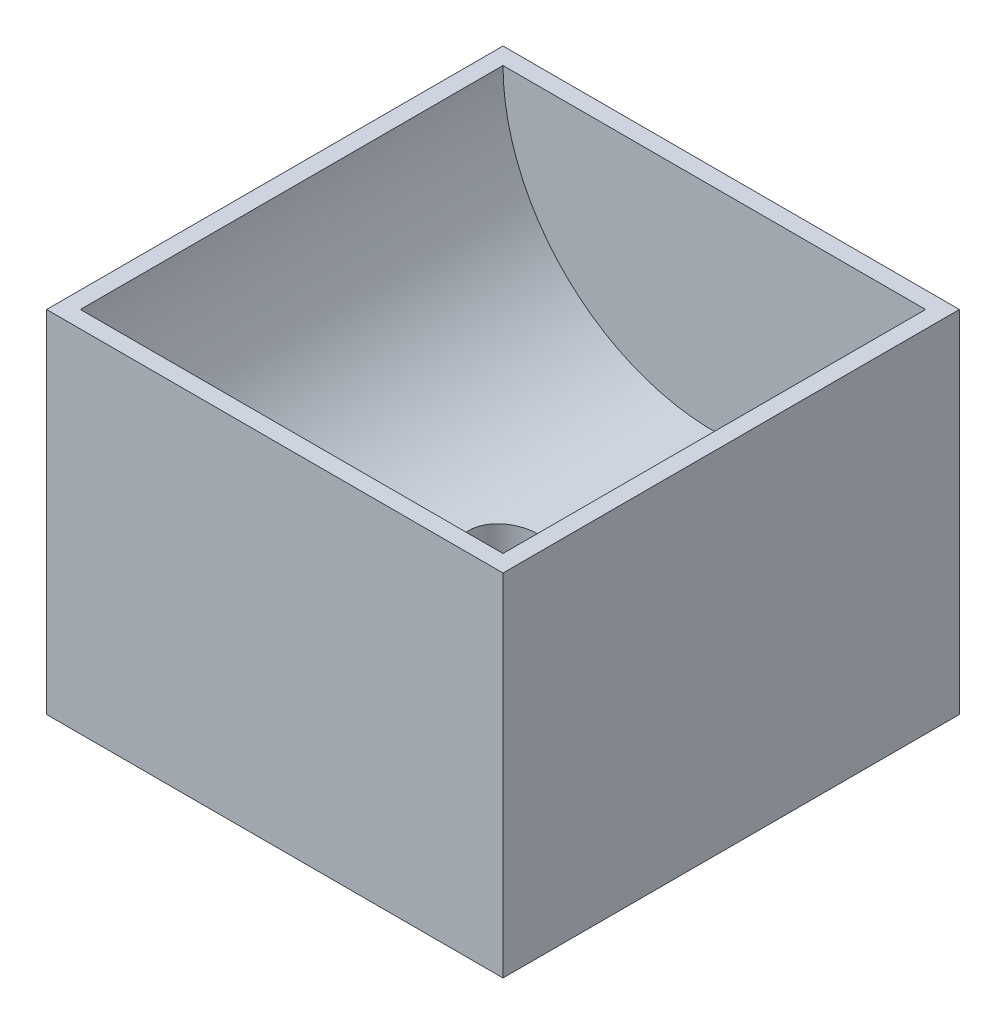
ISO-10303-21;
HEADER;
FILE_DESCRIPTION(('STEP AP214'),'2;1');
FILE_NAME('part.step','',(''),(''),'','','');
FILE_SCHEMA(('AUTOMOTIVE_DESIGN { 1 0 10303 214 1 1 1 1 }'));
ENDSEC;
DATA;
#1=APPLICATION_CONTEXT('core data for automotive mechanical design processes');
#2=APPLICATION_PROTOCOL_DEFINITION('international standard','automotive_design',2000,#1);
#3=PRODUCT_CONTEXT('',#1,'mechanical');
#4=PRODUCT('Part','Part','',(#3));
#5=PRODUCT_RELATED_PRODUCT_CATEGORY('part','',(#4));
#6=PRODUCT_DEFINITION_FORMATION('','',#4);
#7=PRODUCT_DEFINITION_CONTEXT('part definition',#1,'design');
#8=PRODUCT_DEFINITION('design','',#6,#7);
#9=PRODUCT_DEFINITION_SHAPE('','',#8);
#10=(LENGTH_UNIT() NAMED_UNIT(*) SI_UNIT(.MILLI.,.METRE.));
#11=(NAMED_UNIT(*) PLANE_ANGLE_UNIT() SI_UNIT($,.RADIAN.));
#12=(NAMED_UNIT(*) SI_UNIT($,.STERADIAN.) SOLID_ANGLE_UNIT());
#13=UNCERTAINTY_MEASURE_WITH_UNIT(LENGTH_MEASURE(1.E-05),#10,'distance_accuracy_value','');
#14=(GEOMETRIC_REPRESENTATION_CONTEXT(3) GLOBAL_UNCERTAINTY_ASSIGNED_CONTEXT((#13)) GLOBAL_UNIT_ASSIGNED_CONTEXT((#10,
#11,#12)) REPRESENTATION_CONTEXT('',''));
#15=CARTESIAN_POINT('',(0.,0.,0.));
#16=DIRECTION('',(0.,0.,1.));
#17=DIRECTION('',(1.,0.,0.));
#18=AXIS2_PLACEMENT_3D('',#15,#16,#17);
#19=CARTESIAN_POINT('',(-3.75277674973257,-41.5,6.5));
#20=DIRECTION('',(0.866025403784439,0.,-0.5));
#21=DIRECTION('',(-0.5,0.,-0.866025403784439));
#22=AXIS2_PLACEMENT_3D('',#19,#20,#21);
#23=PLANE('',#22);
#24=DIRECTION('',(0.,1.,0.));
#25=VECTOR('',#24,1.);
#26=CARTESIAN_POINT('',(-3.75277674973257,-41.5,6.5));
#27=LINE('',#26,#25);
#28=CARTESIAN_POINT('',(-3.75277674973257,-34.5,6.5));
#29=VERTEX_POINT('',#28);
#30=CARTESIAN_POINT('',(-3.75277674973257,-28.,6.5));
#31=VERTEX_POINT('',#30);
#32=EDGE_CURVE('E145',#29,#31,#27,.T.);
#33=ORIENTED_EDGE('',*,*,#32,.F.);
#34=DIRECTION('',(-0.5,0.,-0.866025403784439));
#35=VECTOR('',#34,1.);
#36=CARTESIAN_POINT('',(-3.75277674973257,-34.5,6.5));
#37=LINE('',#36,#35);
#38=CARTESIAN_POINT('',(-7.50555349946513,-34.5,0.));
#39=VERTEX_POINT('',#38);
#40=EDGE_CURVE('E55',#29,#39,#37,.T.);
#41=ORIENTED_EDGE('',*,*,#40,.T.);
#42=DIRECTION('',(0.,1.,0.));
#43=VECTOR('',#42,1.);
#44=CARTESIAN_POINT('',(-7.50555349946513,-41.5,0.));
#45=LINE('',#44,#43);
#46=CARTESIAN_POINT('',(-7.50555349946513,-28.,0.));
#47=VERTEX_POINT('',#46);
#48=EDGE_CURVE('E159',#39,#47,#45,.T.);
#49=ORIENTED_EDGE('',*,*,#48,.T.);
#50=DIRECTION('',(-0.5,0.,-0.866025403784438));
#51=VECTOR('',#50,1.);
#52=CARTESIAN_POINT('',(-3.75277674973257,-28.,6.5));
#53=LINE('',#52,#51);
#54=EDGE_CURVE('E487',#31,#47,#53,.T.);
#55=ORIENTED_EDGE('',*,*,#54,.F.);
#56=EDGE_LOOP('',(#33,#41,#49,#55));
#57=FACE_BOUND('',#56,.T.);
#58=ADVANCED_FACE('F39',(#57),#23,.T.);
#59=CARTESIAN_POINT('',(-7.50555349946513,-41.5,0.));
#60=DIRECTION('',(0.866025403784439,0.,0.5));
#61=DIRECTION('',(0.5,0.,-0.866025403784439));
#62=AXIS2_PLACEMENT_3D('',#59,#60,#61);
#63=PLANE('',#62);
#64=ORIENTED_EDGE('',*,*,#48,.F.);
#65=DIRECTION('',(0.5,0.,-0.866025403784439));
#66=VECTOR('',#65,1.);
#67=CARTESIAN_POINT('',(-7.50555349946513,-34.5,0.));
#68=LINE('',#67,#66);
#69=CARTESIAN_POINT('',(-3.75277674973257,-34.5,-6.5));
#70=VERTEX_POINT('',#69);
#71=EDGE_CURVE('E492',#39,#70,#68,.T.);
#72=ORIENTED_EDGE('',*,*,#71,.T.);
#73=DIRECTION('',(0.,1.,0.));
#74=VECTOR('',#73,1.);
#75=CARTESIAN_POINT('',(-3.75277674973257,-41.5,-6.5));
#76=LINE('',#75,#74);
#77=CARTESIAN_POINT('',(-3.75277674973257,-28.,-6.5));
#78=VERTEX_POINT('',#77);
#79=EDGE_CURVE('E156',#70,#78,#76,.T.);
#80=ORIENTED_EDGE('',*,*,#79,.T.);
#81=DIRECTION('',(0.5,0.,-0.866025403784439));
#82=VECTOR('',#81,1.);
#83=CARTESIAN_POINT('',(-7.50555349946513,-28.,0.));
#84=LINE('',#83,#82);
#85=EDGE_CURVE('E483',#47,#78,#84,.T.);
#86=ORIENTED_EDGE('',*,*,#85,.F.);
#87=EDGE_LOOP('',(#64,#72,#80,#86));
#88=FACE_BOUND('',#87,.T.);
#89=ADVANCED_FACE('F278',(#88),#63,.T.);
#90=CARTESIAN_POINT('',(-3.75277674973257,-41.5,-6.5));
#91=DIRECTION('',(0.,0.,1.));
#92=DIRECTION('',(1.,0.,0.));
#93=AXIS2_PLACEMENT_3D('',#90,#91,#92);
#94=PLANE('',#93);
#95=ORIENTED_EDGE('',*,*,#79,.F.);
#96=DIRECTION('',(1.,0.,0.));
#97=VECTOR('',#96,1.);
#98=CARTESIAN_POINT('',(-3.75277674973257,-34.5,-6.5));
#99=LINE('',#98,#97);
#100=CARTESIAN_POINT('',(3.75277674973257,-34.5,-6.5));
#101=VERTEX_POINT('',#100);
#102=EDGE_CURVE('E496',#70,#101,#99,.T.);
#103=ORIENTED_EDGE('',*,*,#102,.T.);
#104=DIRECTION('',(0.,1.,0.));
#105=VECTOR('',#104,1.);
#106=CARTESIAN_POINT('',(3.75277674973257,-41.5,-6.5));
#107=LINE('',#106,#105);
#108=CARTESIAN_POINT('',(3.75277674973257,-28.,-6.5));
#109=VERTEX_POINT('',#108);
#110=EDGE_CURVE('E149',#101,#109,#107,.T.);
#111=ORIENTED_EDGE('',*,*,#110,.T.);
#112=DIRECTION('',(1.,0.,0.));
#113=VECTOR('',#112,1.);
#114=CARTESIAN_POINT('',(-3.75277674973257,-28.,-6.5));
#115=LINE('',#114,#113);
#116=EDGE_CURVE('E478',#78,#109,#115,.T.);
#117=ORIENTED_EDGE('',*,*,#116,.F.);
#118=EDGE_LOOP('',(#95,#103,#111,#117));
#119=FACE_BOUND('',#118,.T.);
#120=ADVANCED_FACE('F283',(#119),#94,.T.);
#121=CARTESIAN_POINT('',(3.75277674973257,-41.5,-6.5));
#122=DIRECTION('',(-0.866025403784439,0.,0.5));
#123=DIRECTION('',(0.5,0.,0.866025403784439));
#124=AXIS2_PLACEMENT_3D('',#121,#122,#123);
#125=PLANE('',#124);
#126=ORIENTED_EDGE('',*,*,#110,.F.);
#127=DIRECTION('',(0.5,0.,0.866025403784439));
#128=VECTOR('',#127,1.);
#129=CARTESIAN_POINT('',(3.75277674973257,-34.5,-6.5));
#130=LINE('',#129,#128);
#131=CARTESIAN_POINT('',(7.50555349946513,-34.5,0.));
#132=VERTEX_POINT('',#131);
#133=EDGE_CURVE('E137',#101,#132,#130,.T.);
#134=ORIENTED_EDGE('',*,*,#133,.T.);
#135=DIRECTION('',(0.,1.,0.));
#136=VECTOR('',#135,1.);
#137=CARTESIAN_POINT('',(7.50555349946513,-41.5,0.));
#138=LINE('',#137,#136);
#139=CARTESIAN_POINT('',(7.50555349946513,-28.,0.));
#140=VERTEX_POINT('',#139);
#141=EDGE_CURVE('E135',#132,#140,#138,.T.);
#142=ORIENTED_EDGE('',*,*,#141,.T.);
#143=DIRECTION('',(0.5,0.,0.866025403784439));
#144=VECTOR('',#143,1.);
#145=CARTESIAN_POINT('',(3.75277674973257,-28.,-6.5));
#146=LINE('',#145,#144);
#147=EDGE_CURVE('E473',#109,#140,#146,.T.);
#148=ORIENTED_EDGE('',*,*,#147,.F.);
#149=EDGE_LOOP('',(#126,#134,#142,#148));
#150=FACE_BOUND('',#149,.T.);
#151=ADVANCED_FACE('F289',(#150),#125,.T.);
#152=CARTESIAN_POINT('',(7.50555349946513,-41.5,0.));
#153=DIRECTION('',(-0.866025403784439,0.,-0.5));
#154=DIRECTION('',(-0.5,0.,0.866025403784439));
#155=AXIS2_PLACEMENT_3D('',#152,#153,#154);
#156=PLANE('',#155);
#157=ORIENTED_EDGE('',*,*,#141,.F.);
#158=DIRECTION('',(-0.5,0.,0.866025403784439));
#159=VECTOR('',#158,1.);
#160=CARTESIAN_POINT('',(7.50555349946513,-34.5,0.));
#161=LINE('',#160,#159);
#162=CARTESIAN_POINT('',(3.75277674973257,-34.5,6.5));
#163=VERTEX_POINT('',#162);
#164=EDGE_CURVE('E129',#132,#163,#161,.T.);
#165=ORIENTED_EDGE('',*,*,#164,.T.);
#166=DIRECTION('',(0.,1.,0.));
#167=VECTOR('',#166,1.);
#168=CARTESIAN_POINT('',(3.75277674973257,-41.5,6.5));
#169=LINE('',#168,#167);
#170=CARTESIAN_POINT('',(3.75277674973257,-28.,6.5));
#171=VERTEX_POINT('',#170);
#172=EDGE_CURVE('E62',#163,#171,#169,.T.);
#173=ORIENTED_EDGE('',*,*,#172,.T.);
#174=DIRECTION('',(-0.5,0.,0.866025403784439));
#175=VECTOR('',#174,1.);
#176=CARTESIAN_POINT('',(7.50555349946513,-28.,0.));
#177=LINE('',#176,#175);
#178=EDGE_CURVE('E463',#140,#171,#177,.T.);
#179=ORIENTED_EDGE('',*,*,#178,.F.);
#180=EDGE_LOOP('',(#157,#165,#173,#179));
#181=FACE_BOUND('',#180,.T.);
#182=ADVANCED_FACE('F134',(#181),#156,.T.);
#183=CARTESIAN_POINT('',(3.75277674973257,-41.5,6.5));
#184=DIRECTION('',(0.,0.,-1.));
#185=DIRECTION('',(-1.,0.,0.));
#186=AXIS2_PLACEMENT_3D('',#183,#184,#185);
#187=PLANE('',#186);
#188=ORIENTED_EDGE('',*,*,#172,.F.);
#189=DIRECTION('',(-1.,0.,0.));
#190=VECTOR('',#189,1.);
#191=CARTESIAN_POINT('',(3.75277674973257,-34.5,6.5));
#192=LINE('',#191,#190);
#193=EDGE_CURVE('E11',#163,#29,#192,.T.);
#194=ORIENTED_EDGE('',*,*,#193,.T.);
#195=ORIENTED_EDGE('',*,*,#32,.T.);
#196=DIRECTION('',(-1.,0.,0.));
#197=VECTOR('',#196,1.);
#198=CARTESIAN_POINT('',(3.75277674973257,-28.,6.5));
#199=LINE('',#198,#197);
#200=EDGE_CURVE('E142',#171,#31,#199,.T.);
#201=ORIENTED_EDGE('',*,*,#200,.F.);
#202=EDGE_LOOP('',(#188,#194,#195,#201));
#203=FACE_BOUND('',#202,.T.);
#204=ADVANCED_FACE('F140',(#203),#187,.T.);
#205=CARTESIAN_POINT('',(-27.,0.,25.));
#206=DIRECTION('',(1.,0.,0.));
#207=DIRECTION('',(0.,1.,0.));
#208=AXIS2_PLACEMENT_3D('',#205,#206,#207);
#209=PLANE('',#208);
#210=DIRECTION('',(0.,0.,-1.));
#211=VECTOR('',#210,1.);
#212=CARTESIAN_POINT('',(-27.,0.,25.));
#213=LINE('',#212,#211);
#214=CARTESIAN_POINT('',(-27.,0.,27.));
#215=VERTEX_POINT('',#214);
#216=CARTESIAN_POINT('',(-27.,0.,-27.));
#217=VERTEX_POINT('',#216);
#218=EDGE_CURVE('E218',#215,#217,#213,.T.);
#219=ORIENTED_EDGE('',*,*,#218,.T.);
#220=DIRECTION('',(0.,1.,0.));
#221=VECTOR('',#220,1.);
#222=CARTESIAN_POINT('',(-27.,0.,-27.));
#223=LINE('',#222,#221);
#224=CARTESIAN_POINT('',(-27.,-41.5,-27.));
#225=VERTEX_POINT('',#224);
#226=EDGE_CURVE('E186',#225,#217,#223,.T.);
#227=ORIENTED_EDGE('',*,*,#226,.F.);
#228=DIRECTION('',(0.,0.,-1.));
#229=VECTOR('',#228,1.);
#230=CARTESIAN_POINT('',(-27.,-41.5,-27.));
#231=LINE('',#230,#229);
#232=CARTESIAN_POINT('',(-27.,-41.5,27.));
#233=VERTEX_POINT('',#232);
#234=EDGE_CURVE('E162',#233,#225,#231,.T.);
#235=ORIENTED_EDGE('',*,*,#234,.F.);
#236=DIRECTION('',(0.,-1.,0.));
#237=VECTOR('',#236,1.);
#238=CARTESIAN_POINT('',(-27.,0.,27.));
#239=LINE('',#238,#237);
#240=EDGE_CURVE('E199',#215,#233,#239,.T.);
#241=ORIENTED_EDGE('',*,*,#240,.F.);
#242=EDGE_LOOP('',(#219,#227,#235,#241));
#243=FACE_BOUND('',#242,.T.);
#244=ADVANCED_FACE('F41',(#243),#209,.F.);
#245=CARTESIAN_POINT('',(-27.,-28.,25.));
#246=DIRECTION('',(0.,1.,0.));
#247=DIRECTION('',(0.,0.,1.));
#248=AXIS2_PLACEMENT_3D('',#245,#246,#247);
#249=PLANE('',#248);
#250=ORIENTED_EDGE('',*,*,#178,.T.);
#251=ORIENTED_EDGE('',*,*,#200,.T.);
#252=ORIENTED_EDGE('',*,*,#54,.T.);
#253=ORIENTED_EDGE('',*,*,#85,.T.);
#254=ORIENTED_EDGE('',*,*,#116,.T.);
#255=ORIENTED_EDGE('',*,*,#147,.T.);
#256=EDGE_LOOP('',(#250,#251,#252,#253,#254,#255));
#257=FACE_BOUND('',#256,.T.);
#258=CARTESIAN_POINT('',(0.,-28.,0.));
#259=DIRECTION('',(0.,-1.,0.));
#260=DIRECTION('',(0.,0.,-1.));
#261=AXIS2_PLACEMENT_3D('',#258,#259,#260);
#262=CIRCLE('',#261,4.05);
#263=CARTESIAN_POINT('',(0.,-28.,-4.05));
#264=VERTEX_POINT('',#263);
#265=EDGE_CURVE('E178',#264,#264,#262,.T.);
#266=ORIENTED_EDGE('',*,*,#265,.F.);
#267=EDGE_LOOP('',(#266));
#268=FACE_BOUND('',#267,.T.);
#269=ADVANCED_FACE('F372',(#257,#268),#249,.F.);
#270=CARTESIAN_POINT('',(27.,0.,25.));
#271=DIRECTION('',(-1.,0.,0.));
#272=DIRECTION('',(0.,-1.,0.));
#273=AXIS2_PLACEMENT_3D('',#270,#271,#272);
#274=PLANE('',#273);
#275=DIRECTION('',(0.,1.,0.));
#276=VECTOR('',#275,1.);
#277=CARTESIAN_POINT('',(27.,0.,27.));
#278=LINE('',#277,#276);
#279=CARTESIAN_POINT('',(27.,-41.5,27.));
#280=VERTEX_POINT('',#279);
#281=CARTESIAN_POINT('',(27.,0.,27.));
#282=VERTEX_POINT('',#281);
#283=EDGE_CURVE('E202',#280,#282,#278,.T.);
#284=ORIENTED_EDGE('',*,*,#283,.F.);
#285=DIRECTION('',(0.,0.,1.));
#286=VECTOR('',#285,1.);
#287=CARTESIAN_POINT('',(27.,-41.5,-27.));
#288=LINE('',#287,#286);
#289=CARTESIAN_POINT('',(27.,-41.5,-27.));
#290=VERTEX_POINT('',#289);
#291=EDGE_CURVE('E170',#290,#280,#288,.T.);
#292=ORIENTED_EDGE('',*,*,#291,.F.);
#293=DIRECTION('',(0.,-1.,0.));
#294=VECTOR('',#293,1.);
#295=CARTESIAN_POINT('',(27.,0.,-27.));
#296=LINE('',#295,#294);
#297=CARTESIAN_POINT('',(27.,0.,-27.));
#298=VERTEX_POINT('',#297);
#299=EDGE_CURVE('E183',#298,#290,#296,.T.);
#300=ORIENTED_EDGE('',*,*,#299,.F.);
#301=DIRECTION('',(0.,0.,-1.));
#302=VECTOR('',#301,1.);
#303=CARTESIAN_POINT('',(27.,0.,25.));
#304=LINE('',#303,#302);
#305=EDGE_CURVE('E48',#282,#298,#304,.T.);
#306=ORIENTED_EDGE('',*,*,#305,.F.);
#307=EDGE_LOOP('',(#284,#292,#300,#306));
#308=FACE_BOUND('',#307,.T.);
#309=ADVANCED_FACE('F273',(#308),#274,.F.);
#310=CARTESIAN_POINT('',(0.,0.,25.));
#311=DIRECTION('',(0.,0.,-1.));
#312=DIRECTION('',(-1.,0.,0.));
#313=AXIS2_PLACEMENT_3D('',#310,#311,#312);
#314=CYLINDRICAL_SURFACE('',#313,25.);
#315=CARTESIAN_POINT('',(0.,-25.,-4.05));
#316=CARTESIAN_POINT('',(0.225904941622165,-24.9999961934764,-4.04999086328005));
#317=CARTESIAN_POINT('',(0.451935439243622,-24.9969060661573,-4.03103503458935));
#318=CARTESIAN_POINT('',(0.897663239289137,-24.9848764515723,-3.95574050644908));
#319=CARTESIAN_POINT('',(1.11735441766579,-24.9759314936109,-3.89936684345346));
#320=CARTESIAN_POINT('',(1.54388979151633,-24.9531960700265,-3.75097820197135));
#321=CARTESIAN_POINT('',(1.75074411190022,-24.9394094818384,-3.6589917380909));
#322=CARTESIAN_POINT('',(2.14605421563331,-24.9085088576696,-3.44206190148828));
#323=CARTESIAN_POINT('',(2.33451222960713,-24.8913952258606,-3.3171225312538));
#324=CARTESIAN_POINT('',(2.68941425201728,-24.855566144543,-3.03662958739046));
#325=CARTESIAN_POINT('',(2.85566754139279,-24.8368388409761,-2.88083618935496));
#326=CARTESIAN_POINT('',(3.15979390851473,-24.7999844215049,-2.54357378272033));
#327=CARTESIAN_POINT('',(3.29766524230569,-24.7818573425394,-2.36210319751806));
#328=CARTESIAN_POINT('',(3.54187208650707,-24.7481409442433,-1.97733579698426));
#329=CARTESIAN_POINT('',(3.6480201700076,-24.7325669438563,-1.77391856493269));
#330=CARTESIAN_POINT('',(3.82456902883672,-24.7058837876552,-1.35184704790755));
#331=CARTESIAN_POINT('',(3.89497208230338,-24.6947743473108,-1.13319373498551));
#332=CARTESIAN_POINT('',(3.99743395180631,-24.6783957627468,-0.688874039514271));
#333=CARTESIAN_POINT('',(4.02982125765026,-24.6730766147854,-0.463285285755881));
#334=CARTESIAN_POINT('',(4.05635051331019,-24.6687294550054,-0.00981733674435749));
#335=CARTESIAN_POINT('',(4.05049502081669,-24.6697010224617,0.218061704315857));
#336=CARTESIAN_POINT('',(4.00097271605705,-24.6777798431963,0.667303767984101));
#337=CARTESIAN_POINT('',(3.95767399543278,-24.6848273638047,0.88870859732611));
#338=CARTESIAN_POINT('',(3.83507156711337,-24.7041705677243,1.32106890227756));
#339=CARTESIAN_POINT('',(3.75576668693695,-24.7164664219381,1.5320240373618));
#340=CARTESIAN_POINT('',(3.56302713098684,-24.7449858091278,1.93860387763864));
#341=CARTESIAN_POINT('',(3.44943871741267,-24.7612269686571,2.13415441609948));
#342=CARTESIAN_POINT('',(3.19146570115959,-24.7957946178875,2.50355929915205));
#343=CARTESIAN_POINT('',(3.04707874729407,-24.8141212667469,2.67741198570437));
#344=CARTESIAN_POINT('',(2.7295973752225,-24.8510578332574,3.00061758480667));
#345=CARTESIAN_POINT('',(2.55618694702339,-24.8696685570055,3.14966016658154));
#346=CARTESIAN_POINT('',(2.18665227170224,-24.9048779116795,3.41657742775882));
#347=CARTESIAN_POINT('',(1.9905278928337,-24.9214765309337,3.53445192636566));
#348=CARTESIAN_POINT('',(1.58084739942649,-24.9508131545028,3.7357116580168));
#349=CARTESIAN_POINT('',(1.36727808760575,-24.9635482010002,3.81907048477718));
#350=CARTESIAN_POINT('',(0.928918698808064,-24.9836987735145,3.94864992211037));
#351=CARTESIAN_POINT('',(0.70412950956313,-24.9911147196745,3.99487346594571));
#352=CARTESIAN_POINT('',(0.25238711137549,-24.9997352674817,4.04845186325925));
#353=CARTESIAN_POINT('',(0.0254857048201214,-25.0010079735628,4.05623291603066));
#354=CARTESIAN_POINT('',(-0.426379540073973,-24.9973848419376,4.03384026862514));
#355=CARTESIAN_POINT('',(-0.651343448414816,-24.9924892280431,4.00366794555094));
#356=CARTESIAN_POINT('',(-1.09163874189494,-24.9771216796237,3.90657950086741));
#357=CARTESIAN_POINT('',(-1.3070176487652,-24.9666816297807,3.8398734080296));
#358=CARTESIAN_POINT('',(-1.72353500463252,-24.9413913707769,3.67183416187441));
#359=CARTESIAN_POINT('',(-1.92467269030422,-24.9265409254415,3.57049915415072));
#360=CARTESIAN_POINT('',(-2.30885594868339,-24.8939090791851,3.33509559325188));
#361=CARTESIAN_POINT('',(-2.49173562116102,-24.8761041392849,3.20075961269004));
#362=CARTESIAN_POINT('',(-2.83250780907755,-24.8396120068525,2.90353657085682));
#363=CARTESIAN_POINT('',(-2.99039861432037,-24.8209247540499,2.74064755707027));
#364=CARTESIAN_POINT('',(-3.27828256151623,-24.7845551791635,2.38903479857993));
#365=CARTESIAN_POINT('',(-3.40798838714218,-24.766884445078,2.20007442709659));
#366=CARTESIAN_POINT('',(-3.63381665804737,-24.7347618079045,1.80279725531662));
#367=CARTESIAN_POINT('',(-3.72994012433369,-24.7203098069619,1.59448104374091));
#368=CARTESIAN_POINT('',(-3.88544082513768,-24.6963470280393,1.16522435003992));
#369=CARTESIAN_POINT('',(-3.94496344162132,-24.6868167251159,0.944337672243569));
#370=CARTESIAN_POINT('',(-4.02603189591409,-24.6737265605381,0.495535006331872));
#371=CARTESIAN_POINT('',(-4.04758083598822,-24.6701662111687,0.267619593978031));
#372=CARTESIAN_POINT('',(-4.05200739704203,-24.6694392859081,-0.185903406261004));
#373=CARTESIAN_POINT('',(-4.03533711301245,-24.6721979619537,-0.411506589960847));
#374=CARTESIAN_POINT('',(-3.96477346920322,-24.6836348318998,-0.8566537596565));
#375=CARTESIAN_POINT('',(-3.91088021130487,-24.6923130095984,-1.0761977622349));
#376=CARTESIAN_POINT('',(-3.76756983310923,-24.7145833208507,-1.50283402460804));
#377=CARTESIAN_POINT('',(-3.67818952210202,-24.7281703613285,-1.70993893151023));
#378=CARTESIAN_POINT('',(-3.46648818843274,-24.7587327593538,-2.10628700693225));
#379=CARTESIAN_POINT('',(-3.34416568071904,-24.7757082696464,-2.29552936967962));
#380=CARTESIAN_POINT('',(-3.06843025618658,-24.811372855856,-2.65306838018514));
#381=CARTESIAN_POINT('',(-2.9146840625354,-24.8300790135039,-2.8211063345267));
#382=CARTESIAN_POINT('',(-2.5811690987387,-24.866959107524,-3.12915399846034));
#383=CARTESIAN_POINT('',(-2.40139432082136,-24.8851329198556,-3.26915721940531));
#384=CARTESIAN_POINT('',(-2.01954214880413,-24.9190368036741,-3.51798673595506));
#385=CARTESIAN_POINT('',(-1.81732758258995,-24.9347502497644,-3.62660479592379));
#386=CARTESIAN_POINT('',(-1.39735492071511,-24.9618009013644,-3.80816598500582));
#387=CARTESIAN_POINT('',(-1.17961274064209,-24.973142513665,-3.88114505798834));
#388=CARTESIAN_POINT('',(-0.800821196414011,-24.987663381964,-3.9733076516855));
#389=CARTESIAN_POINT('',(-0.64207746139349,-24.9922651690441,-4.00202184047208));
#390=CARTESIAN_POINT('',(-0.322243757958618,-24.9984348119197,-4.04037112343737));
#391=CARTESIAN_POINT('',(-0.16115382650699,-25.00000271546,-4.05000651786265));
#392=CARTESIAN_POINT('',(0.,-25.,-4.05));
#393=B_SPLINE_CURVE_WITH_KNOTS('',3,(#315,#316,#317,#318,#319,#320,#321,#322,#323,#324,#325,
#326,#327,#328,#329,#330,#331,#332,#333,#334,#335,#336,#337,#338,#339,#340,#341,#342,#343,#344,
#345,#346,#347,#348,#349,#350,#351,#352,#353,#354,#355,#356,#357,#358,#359,#360,#361,#362,#363,
#364,#365,#366,#367,#368,#369,#370,#371,#372,#373,#374,#375,#376,#377,#378,#379,#380,#381,#382,
#383,#384,#385,#386,#387,#388,#389,#390,#391,#392),.UNSPECIFIED.,.T.,.F.,(4,2,2,2,2,2,2,2,2,2,2,
2,2,2,2,2,2,2,2,2,2,2,2,2,2,2,2,2,2,2,2,2,2,2,2,2,2,2,4),(0.,0.677125816897778,1.35488523837845,
2.03210310720666,2.70923875843311,3.39186031286574,4.07452379909867,4.76114428476695,
5.44772100455552,6.12832036825223,6.80887421371311,7.482812853352,8.1567734402668,
8.8338023441129,9.5108829514275,10.1958826696799,10.8808863612981,11.5664131523583,
12.2518857893186,12.9297414918444,13.6075725997196,14.281547219687,14.9555579371957,
15.6352220001272,16.3149325580298,17.0012769776374,17.6876005284462,18.3711800247511,
19.0547036733405,19.7301837028493,20.4056618835402,21.0804412407615,21.7552510224862,
22.43762839497,23.1201635218058,23.8071283107365,24.4933988197829,24.9764477205331,
25.4594890193917),.UNSPECIFIED.);
#394=CARTESIAN_POINT('',(0.,-25.,-4.05));
#395=VERTEX_POINT('',#394);
#396=EDGE_CURVE('E182',#395,#395,#393,.T.);
#397=ORIENTED_EDGE('',*,*,#396,.T.);
#398=EDGE_LOOP('',(#397));
#399=FACE_BOUND('',#398,.T.);
#400=CARTESIAN_POINT('',(0.,0.,-25.));
#401=DIRECTION('',(0.,0.,-1.));
#402=DIRECTION('',(1.,0.,0.));
#403=AXIS2_PLACEMENT_3D('',#400,#401,#402);
#404=CIRCLE('',#403,25.);
#405=CARTESIAN_POINT('',(25.,0.,-25.));
#406=VERTEX_POINT('',#405);
#407=CARTESIAN_POINT('',(-25.,0.,-25.));
#408=VERTEX_POINT('',#407);
#409=EDGE_CURVE('E210',#406,#408,#404,.T.);
#410=ORIENTED_EDGE('',*,*,#409,.T.);
#411=DIRECTION('',(0.,0.,-1.));
#412=VECTOR('',#411,1.);
#413=CARTESIAN_POINT('',(-25.,0.,25.));
#414=LINE('',#413,#412);
#415=CARTESIAN_POINT('',(-25.,0.,25.));
#416=VERTEX_POINT('',#415);
#417=EDGE_CURVE('E224',#416,#408,#414,.T.);
#418=ORIENTED_EDGE('',*,*,#417,.F.);
#419=CARTESIAN_POINT('',(0.,0.,25.));
#420=DIRECTION('',(0.,0.,-1.));
#421=DIRECTION('',(1.,0.,0.));
#422=AXIS2_PLACEMENT_3D('',#419,#420,#421);
#423=CIRCLE('',#422,25.);
#424=CARTESIAN_POINT('',(25.,0.,25.));
#425=VERTEX_POINT('',#424);
#426=EDGE_CURVE('E214',#425,#416,#423,.T.);
#427=ORIENTED_EDGE('',*,*,#426,.F.);
#428=DIRECTION('',(0.,0.,-1.));
#429=VECTOR('',#428,1.);
#430=CARTESIAN_POINT('',(25.,0.,25.));
#431=LINE('',#430,#429);
#432=EDGE_CURVE('E228',#425,#406,#431,.T.);
#433=ORIENTED_EDGE('',*,*,#432,.T.);
#434=EDGE_LOOP('',(#410,#418,#427,#433));
#435=FACE_BOUND('',#434,.T.);
#436=ADVANCED_FACE('F240',(#399,#435),#314,.F.);
#437=CARTESIAN_POINT('',(-27.,0.,25.));
#438=DIRECTION('',(0.,-1.,0.));
#439=DIRECTION('',(0.,0.,-1.));
#440=AXIS2_PLACEMENT_3D('',#437,#438,#439);
#441=PLANE('',#440);
#442=DIRECTION('',(1.,0.,0.));
#443=VECTOR('',#442,1.);
#444=CARTESIAN_POINT('',(27.,0.,-27.));
#445=LINE('',#444,#443);
#446=EDGE_CURVE('E191',#217,#298,#445,.T.);
#447=ORIENTED_EDGE('',*,*,#446,.F.);
#448=ORIENTED_EDGE('',*,*,#218,.F.);
#449=DIRECTION('',(-1.,0.,0.));
#450=VECTOR('',#449,1.);
#451=CARTESIAN_POINT('',(-27.,0.,27.));
#452=LINE('',#451,#450);
#453=EDGE_CURVE('E206',#282,#215,#452,.T.);
#454=ORIENTED_EDGE('',*,*,#453,.F.);
#455=ORIENTED_EDGE('',*,*,#305,.T.);
#456=EDGE_LOOP('',(#447,#448,#454,#455));
#457=FACE_BOUND('',#456,.T.);
#458=ORIENTED_EDGE('',*,*,#417,.T.);
#459=DIRECTION('',(1.,0.,0.));
#460=VECTOR('',#459,1.);
#461=CARTESIAN_POINT('',(27.,0.,-25.));
#462=LINE('',#461,#460);
#463=EDGE_CURVE('E187',#408,#406,#462,.T.);
#464=ORIENTED_EDGE('',*,*,#463,.T.);
#465=ORIENTED_EDGE('',*,*,#432,.F.);
#466=DIRECTION('',(-1.,0.,0.));
#467=VECTOR('',#466,1.);
#468=CARTESIAN_POINT('',(-27.,0.,25.));
#469=LINE('',#468,#467);
#470=EDGE_CURVE('E195',#425,#416,#469,.T.);
#471=ORIENTED_EDGE('',*,*,#470,.T.);
#472=EDGE_LOOP('',(#458,#464,#465,#471));
#473=FACE_BOUND('',#472,.T.);
#474=ADVANCED_FACE('F266',(#457,#473),#441,.F.);
#475=CARTESIAN_POINT('',(0.,0.,25.));
#476=DIRECTION('',(0.,0.,1.));
#477=DIRECTION('',(1.,0.,0.));
#478=AXIS2_PLACEMENT_3D('',#475,#476,#477);
#479=PLANE('',#478);
#480=ORIENTED_EDGE('',*,*,#470,.F.);
#481=ORIENTED_EDGE('',*,*,#426,.T.);
#482=EDGE_LOOP('',(#480,#481));
#483=FACE_BOUND('',#482,.T.);
#484=ADVANCED_FACE('F263',(#483),#479,.F.);
#485=CARTESIAN_POINT('',(0.,0.,27.));
#486=DIRECTION('',(0.,0.,1.));
#487=DIRECTION('',(1.,0.,0.));
#488=AXIS2_PLACEMENT_3D('',#485,#486,#487);
#489=PLANE('',#488);
#490=ORIENTED_EDGE('',*,*,#240,.T.);
#491=DIRECTION('',(-1.,0.,0.));
#492=VECTOR('',#491,1.);
#493=CARTESIAN_POINT('',(-27.,-41.5,27.));
#494=LINE('',#493,#492);
#495=EDGE_CURVE('E174',#280,#233,#494,.T.);
#496=ORIENTED_EDGE('',*,*,#495,.F.);
#497=ORIENTED_EDGE('',*,*,#283,.T.);
#498=ORIENTED_EDGE('',*,*,#453,.T.);
#499=EDGE_LOOP('',(#490,#496,#497,#498));
#500=FACE_BOUND('',#499,.T.);
#501=ADVANCED_FACE('F259',(#500),#489,.T.);
#502=CARTESIAN_POINT('',(0.,0.,-25.));
#503=DIRECTION('',(0.,0.,-1.));
#504=DIRECTION('',(-1.,0.,0.));
#505=AXIS2_PLACEMENT_3D('',#502,#503,#504);
#506=PLANE('',#505);
#507=ORIENTED_EDGE('',*,*,#409,.F.);
#508=ORIENTED_EDGE('',*,*,#463,.F.);
#509=EDGE_LOOP('',(#507,#508));
#510=FACE_BOUND('',#509,.T.);
#511=ADVANCED_FACE('F255',(#510),#506,.F.);
#512=CARTESIAN_POINT('',(0.,0.,-27.));
#513=DIRECTION('',(0.,0.,-1.));
#514=DIRECTION('',(-1.,0.,0.));
#515=AXIS2_PLACEMENT_3D('',#512,#513,#514);
#516=PLANE('',#515);
#517=ORIENTED_EDGE('',*,*,#299,.T.);
#518=DIRECTION('',(1.,0.,0.));
#519=VECTOR('',#518,1.);
#520=CARTESIAN_POINT('',(-27.,-41.5,-27.));
#521=LINE('',#520,#519);
#522=EDGE_CURVE('E166',#225,#290,#521,.T.);
#523=ORIENTED_EDGE('',*,*,#522,.F.);
#524=ORIENTED_EDGE('',*,*,#226,.T.);
#525=ORIENTED_EDGE('',*,*,#446,.T.);
#526=EDGE_LOOP('',(#517,#523,#524,#525));
#527=FACE_BOUND('',#526,.T.);
#528=ADVANCED_FACE('F250',(#527),#516,.T.);
#529=CARTESIAN_POINT('',(0.,0.,0.));
#530=DIRECTION('',(0.,-1.,0.));
#531=DIRECTION('',(0.,0.,-1.));
#532=AXIS2_PLACEMENT_3D('',#529,#530,#531);
#533=CYLINDRICAL_SURFACE('',#532,4.05);
#534=ORIENTED_EDGE('',*,*,#265,.T.);
#535=EDGE_LOOP('',(#534));
#536=FACE_BOUND('',#535,.T.);
#537=ORIENTED_EDGE('',*,*,#396,.F.);
#538=EDGE_LOOP('',(#537));
#539=FACE_BOUND('',#538,.T.);
#540=ADVANCED_FACE('F244',(#536,#539),#533,.F.);
#541=CARTESIAN_POINT('',(0.,-41.5,0.));
#542=DIRECTION('',(0.,1.,0.));
#543=DIRECTION('',(0.,0.,1.));
#544=AXIS2_PLACEMENT_3D('',#541,#542,#543);
#545=PLANE('',#544);
#546=CARTESIAN_POINT('',(0.,-41.5,0.));
#547=DIRECTION('',(0.,-1.,0.));
#548=DIRECTION('',(0.,0.,-1.));
#549=AXIS2_PLACEMENT_3D('',#546,#547,#548);
#550=CIRCLE('',#549,8.);
#551=CARTESIAN_POINT('',(0.,-41.5,-8.));
#552=VERTEX_POINT('',#551);
#553=EDGE_CURVE('E502',#552,#552,#550,.T.);
#554=ORIENTED_EDGE('',*,*,#553,.F.);
#555=EDGE_LOOP('',(#554));
#556=FACE_BOUND('',#555,.T.);
#557=ORIENTED_EDGE('',*,*,#234,.T.);
#558=ORIENTED_EDGE('',*,*,#522,.T.);
#559=ORIENTED_EDGE('',*,*,#291,.T.);
#560=ORIENTED_EDGE('',*,*,#495,.T.);
#561=EDGE_LOOP('',(#557,#558,#559,#560));
#562=FACE_BOUND('',#561,.T.);
#563=ADVANCED_FACE('F249',(#556,#562),#545,.F.);
#564=CARTESIAN_POINT('',(0.,-34.5,0.));
#565=DIRECTION('',(0.,-1.,0.));
#566=DIRECTION('',(0.,0.,-1.));
#567=AXIS2_PLACEMENT_3D('',#564,#565,#566);
#568=CYLINDRICAL_SURFACE('',#567,8.);
#569=CARTESIAN_POINT('',(0.,-34.5,0.));
#570=DIRECTION('',(0.,-1.,0.));
#571=DIRECTION('',(0.,0.,-1.));
#572=AXIS2_PLACEMENT_3D('',#569,#570,#571);
#573=CIRCLE('',#572,8.);
#574=CARTESIAN_POINT('',(0.,-34.5,-8.));
#575=VERTEX_POINT('',#574);
#576=EDGE_CURVE('E138',#575,#575,#573,.T.);
#577=ORIENTED_EDGE('',*,*,#576,.F.);
#578=EDGE_LOOP('',(#577));
#579=FACE_BOUND('',#578,.T.);
#580=ORIENTED_EDGE('',*,*,#553,.T.);
#581=EDGE_LOOP('',(#580));
#582=FACE_BOUND('',#581,.T.);
#583=ADVANCED_FACE('F298',(#579,#582),#568,.F.);
#584=CARTESIAN_POINT('',(0.,-34.5,0.));
#585=DIRECTION('',(0.,-1.,0.));
#586=DIRECTION('',(0.,0.,-1.));
#587=AXIS2_PLACEMENT_3D('',#584,#585,#586);
#588=PLANE('',#587);
#589=ORIENTED_EDGE('',*,*,#193,.F.);
#590=ORIENTED_EDGE('',*,*,#164,.F.);
#591=ORIENTED_EDGE('',*,*,#133,.F.);
#592=ORIENTED_EDGE('',*,*,#102,.F.);
#593=ORIENTED_EDGE('',*,*,#71,.F.);
#594=ORIENTED_EDGE('',*,*,#40,.F.);
#595=EDGE_LOOP('',(#589,#590,#591,#592,#593,#594));
#596=FACE_BOUND('',#595,.T.);
#597=ORIENTED_EDGE('',*,*,#576,.T.);
#598=EDGE_LOOP('',(#597));
#599=FACE_BOUND('',#598,.T.);
#600=ADVANCED_FACE('F127',(#596,#599),#588,.T.);
#601=CLOSED_SHELL('',(#58,#89,#120,#151,#182,#204,#244,#269,#309,#436,#474,#484,#501,#511,#528,
#540,#563,#583,#600));
#602=MANIFOLD_SOLID_BREP('B2',#601);
#603=ADVANCED_BREP_SHAPE_REPRESENTATION('',(#18,#602),#14);
#604=SHAPE_DEFINITION_REPRESENTATION(#9,#603);
ENDSEC;
END-ISO-10303-21;
